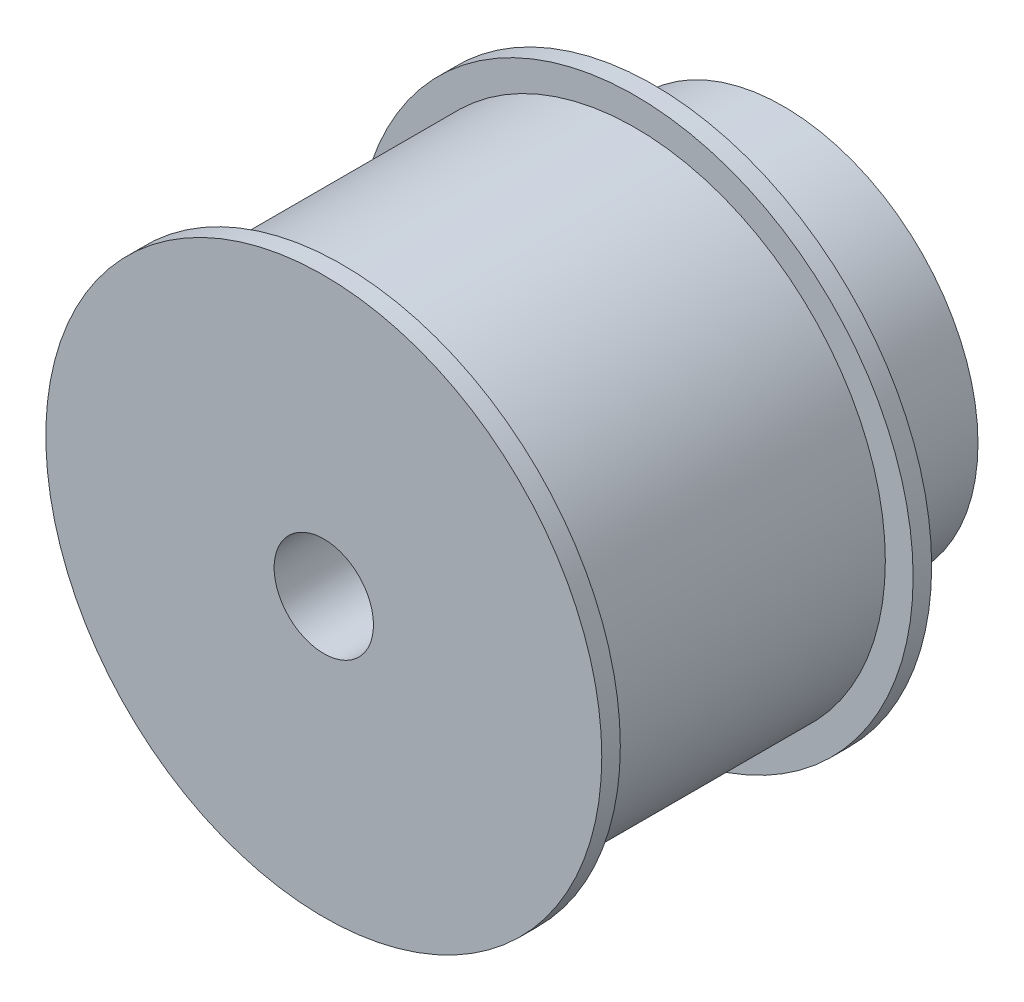
ISO-10303-21;
HEADER;
FILE_DESCRIPTION(('STEP AP214'),'2;1');
FILE_NAME('part.step','',(''),(''),'','','');
FILE_SCHEMA(('AUTOMOTIVE_DESIGN { 1 0 10303 214 1 1 1 1 }'));
ENDSEC;
DATA;
#1=APPLICATION_CONTEXT('core data for automotive mechanical design processes');
#2=APPLICATION_PROTOCOL_DEFINITION('international standard','automotive_design',2000,#1);
#3=PRODUCT_CONTEXT('',#1,'mechanical');
#4=PRODUCT('Part','Part','',(#3));
#5=PRODUCT_RELATED_PRODUCT_CATEGORY('part','',(#4));
#6=PRODUCT_DEFINITION_FORMATION('','',#4);
#7=PRODUCT_DEFINITION_CONTEXT('part definition',#1,'design');
#8=PRODUCT_DEFINITION('design','',#6,#7);
#9=PRODUCT_DEFINITION_SHAPE('','',#8);
#10=(LENGTH_UNIT() NAMED_UNIT(*) SI_UNIT(.MILLI.,.METRE.));
#11=(NAMED_UNIT(*) PLANE_ANGLE_UNIT() SI_UNIT($,.RADIAN.));
#12=(NAMED_UNIT(*) SI_UNIT($,.STERADIAN.) SOLID_ANGLE_UNIT());
#13=UNCERTAINTY_MEASURE_WITH_UNIT(LENGTH_MEASURE(1.E-05),#10,'distance_accuracy_value','');
#14=(GEOMETRIC_REPRESENTATION_CONTEXT(3) GLOBAL_UNCERTAINTY_ASSIGNED_CONTEXT((#13)) GLOBAL_UNIT_ASSIGNED_CONTEXT((#10,
#11,#12)) REPRESENTATION_CONTEXT('',''));
#15=CARTESIAN_POINT('',(0.,0.,0.));
#16=DIRECTION('',(0.,0.,1.));
#17=DIRECTION('',(1.,0.,0.));
#18=AXIS2_PLACEMENT_3D('',#15,#16,#17);
#19=CARTESIAN_POINT('',(0.,0.,0.));
#20=DIRECTION('',(0.,0.,1.));
#21=DIRECTION('',(1.,0.,0.));
#22=AXIS2_PLACEMENT_3D('',#19,#20,#21);
#23=CYLINDRICAL_SURFACE('',#22,2.68);
#24=CARTESIAN_POINT('',(0.,0.,-24.8));
#25=DIRECTION('',(0.,0.,1.));
#26=DIRECTION('',(1.,0.,0.));
#27=AXIS2_PLACEMENT_3D('',#24,#25,#26);
#28=CIRCLE('',#27,2.68);
#29=CARTESIAN_POINT('',(2.68,0.,-24.8));
#30=VERTEX_POINT('',#29);
#31=EDGE_CURVE('E80',#30,#30,#28,.T.);
#32=ORIENTED_EDGE('',*,*,#31,.F.);
#33=EDGE_LOOP('',(#32));
#34=FACE_BOUND('',#33,.T.);
#35=CARTESIAN_POINT('',(0.,0.,0.));
#36=DIRECTION('',(0.,0.,1.));
#37=DIRECTION('',(1.,0.,0.));
#38=AXIS2_PLACEMENT_3D('',#35,#36,#37);
#39=CIRCLE('',#38,2.68);
#40=CARTESIAN_POINT('',(2.68,0.,0.));
#41=VERTEX_POINT('',#40);
#42=EDGE_CURVE('E10',#41,#41,#39,.T.);
#43=ORIENTED_EDGE('',*,*,#42,.T.);
#44=EDGE_LOOP('',(#43));
#45=FACE_BOUND('',#44,.T.);
#46=ADVANCED_FACE('F37',(#34,#45),#23,.F.);
#47=CARTESIAN_POINT('',(0.,2.68,0.));
#48=DIRECTION('',(0.,0.,-1.));
#49=DIRECTION('',(-1.,0.,0.));
#50=AXIS2_PLACEMENT_3D('',#47,#48,#49);
#51=PLANE('',#50);
#52=ORIENTED_EDGE('',*,*,#42,.F.);
#53=EDGE_LOOP('',(#52));
#54=FACE_BOUND('',#53,.T.);
#55=CARTESIAN_POINT('',(0.,0.,0.));
#56=DIRECTION('',(0.,0.,1.));
#57=DIRECTION('',(1.,0.,0.));
#58=AXIS2_PLACEMENT_3D('',#55,#56,#57);
#59=CIRCLE('',#58,15.);
#60=CARTESIAN_POINT('',(15.,0.,0.));
#61=VERTEX_POINT('',#60);
#62=EDGE_CURVE('E44',#61,#61,#59,.T.);
#63=ORIENTED_EDGE('',*,*,#62,.T.);
#64=EDGE_LOOP('',(#63));
#65=FACE_BOUND('',#64,.T.);
#66=ADVANCED_FACE('F88',(#54,#65),#51,.F.);
#67=CARTESIAN_POINT('',(0.,0.,0.));
#68=DIRECTION('',(0.,0.,1.));
#69=DIRECTION('',(1.,0.,0.));
#70=AXIS2_PLACEMENT_3D('',#67,#68,#69);
#71=CYLINDRICAL_SURFACE('',#70,15.);
#72=ORIENTED_EDGE('',*,*,#62,.F.);
#73=EDGE_LOOP('',(#72));
#74=FACE_BOUND('',#73,.T.);
#75=CARTESIAN_POINT('',(0.,0.,-1.));
#76=DIRECTION('',(0.,0.,1.));
#77=DIRECTION('',(1.,0.,0.));
#78=AXIS2_PLACEMENT_3D('',#75,#76,#77);
#79=CIRCLE('',#78,15.);
#80=CARTESIAN_POINT('',(15.,0.,-1.));
#81=VERTEX_POINT('',#80);
#82=EDGE_CURVE('E49',#81,#81,#79,.T.);
#83=ORIENTED_EDGE('',*,*,#82,.T.);
#84=EDGE_LOOP('',(#83));
#85=FACE_BOUND('',#84,.T.);
#86=ADVANCED_FACE('F92',(#74,#85),#71,.T.);
#87=CARTESIAN_POINT('',(0.,15.,-1.));
#88=DIRECTION('',(0.,0.,1.));
#89=DIRECTION('',(1.,0.,0.));
#90=AXIS2_PLACEMENT_3D('',#87,#88,#89);
#91=PLANE('',#90);
#92=ORIENTED_EDGE('',*,*,#82,.F.);
#93=EDGE_LOOP('',(#92));
#94=FACE_BOUND('',#93,.T.);
#95=CARTESIAN_POINT('',(0.,0.,-1.));
#96=DIRECTION('',(0.,0.,1.));
#97=DIRECTION('',(1.,0.,0.));
#98=AXIS2_PLACEMENT_3D('',#95,#96,#97);
#99=CIRCLE('',#98,13.5);
#100=CARTESIAN_POINT('',(13.5,0.,-1.));
#101=VERTEX_POINT('',#100);
#102=EDGE_CURVE('E54',#101,#101,#99,.T.);
#103=ORIENTED_EDGE('',*,*,#102,.T.);
#104=EDGE_LOOP('',(#103));
#105=FACE_BOUND('',#104,.T.);
#106=ADVANCED_FACE('F97',(#94,#105),#91,.F.);
#107=CARTESIAN_POINT('',(0.,0.,0.));
#108=DIRECTION('',(0.,0.,1.));
#109=DIRECTION('',(1.,0.,0.));
#110=AXIS2_PLACEMENT_3D('',#107,#108,#109);
#111=CYLINDRICAL_SURFACE('',#110,13.5);
#112=ORIENTED_EDGE('',*,*,#102,.F.);
#113=EDGE_LOOP('',(#112));
#114=FACE_BOUND('',#113,.T.);
#115=CARTESIAN_POINT('',(0.,0.,-16.8));
#116=DIRECTION('',(0.,0.,1.));
#117=DIRECTION('',(1.,0.,0.));
#118=AXIS2_PLACEMENT_3D('',#115,#116,#117);
#119=CIRCLE('',#118,13.5);
#120=CARTESIAN_POINT('',(13.5,0.,-16.8));
#121=VERTEX_POINT('',#120);
#122=EDGE_CURVE('E60',#121,#121,#119,.T.);
#123=ORIENTED_EDGE('',*,*,#122,.T.);
#124=EDGE_LOOP('',(#123));
#125=FACE_BOUND('',#124,.T.);
#126=ADVANCED_FACE('F103',(#114,#125),#111,.T.);
#127=CARTESIAN_POINT('',(0.,13.5,-16.8));
#128=DIRECTION('',(0.,0.,-1.));
#129=DIRECTION('',(-1.,0.,0.));
#130=AXIS2_PLACEMENT_3D('',#127,#128,#129);
#131=PLANE('',#130);
#132=ORIENTED_EDGE('',*,*,#122,.F.);
#133=EDGE_LOOP('',(#132));
#134=FACE_BOUND('',#133,.T.);
#135=CARTESIAN_POINT('',(0.,0.,-16.8));
#136=DIRECTION('',(0.,0.,1.));
#137=DIRECTION('',(1.,0.,0.));
#138=AXIS2_PLACEMENT_3D('',#135,#136,#137);
#139=CIRCLE('',#138,15.);
#140=CARTESIAN_POINT('',(15.,0.,-16.8));
#141=VERTEX_POINT('',#140);
#142=EDGE_CURVE('E64',#141,#141,#139,.T.);
#143=ORIENTED_EDGE('',*,*,#142,.T.);
#144=EDGE_LOOP('',(#143));
#145=FACE_BOUND('',#144,.T.);
#146=ADVANCED_FACE('F107',(#134,#145),#131,.F.);
#147=CARTESIAN_POINT('',(0.,0.,0.));
#148=DIRECTION('',(0.,0.,1.));
#149=DIRECTION('',(1.,0.,0.));
#150=AXIS2_PLACEMENT_3D('',#147,#148,#149);
#151=CYLINDRICAL_SURFACE('',#150,15.);
#152=ORIENTED_EDGE('',*,*,#142,.F.);
#153=EDGE_LOOP('',(#152));
#154=FACE_BOUND('',#153,.T.);
#155=CARTESIAN_POINT('',(0.,0.,-17.8));
#156=DIRECTION('',(0.,0.,1.));
#157=DIRECTION('',(1.,0.,0.));
#158=AXIS2_PLACEMENT_3D('',#155,#156,#157);
#159=CIRCLE('',#158,15.);
#160=CARTESIAN_POINT('',(15.,0.,-17.8));
#161=VERTEX_POINT('',#160);
#162=EDGE_CURVE('E68',#161,#161,#159,.T.);
#163=ORIENTED_EDGE('',*,*,#162,.T.);
#164=EDGE_LOOP('',(#163));
#165=FACE_BOUND('',#164,.T.);
#166=ADVANCED_FACE('F111',(#154,#165),#151,.T.);
#167=CARTESIAN_POINT('',(0.,15.,-17.8));
#168=DIRECTION('',(0.,0.,1.));
#169=DIRECTION('',(1.,0.,0.));
#170=AXIS2_PLACEMENT_3D('',#167,#168,#169);
#171=PLANE('',#170);
#172=ORIENTED_EDGE('',*,*,#162,.F.);
#173=EDGE_LOOP('',(#172));
#174=FACE_BOUND('',#173,.T.);
#175=CARTESIAN_POINT('',(0.,0.,-17.8));
#176=DIRECTION('',(0.,0.,1.));
#177=DIRECTION('',(1.,0.,0.));
#178=AXIS2_PLACEMENT_3D('',#175,#176,#177);
#179=CIRCLE('',#178,10.5);
#180=CARTESIAN_POINT('',(10.5,0.,-17.8));
#181=VERTEX_POINT('',#180);
#182=EDGE_CURVE('E72',#181,#181,#179,.T.);
#183=ORIENTED_EDGE('',*,*,#182,.T.);
#184=EDGE_LOOP('',(#183));
#185=FACE_BOUND('',#184,.T.);
#186=ADVANCED_FACE('F115',(#174,#185),#171,.F.);
#187=CARTESIAN_POINT('',(0.,0.,0.));
#188=DIRECTION('',(0.,0.,1.));
#189=DIRECTION('',(1.,0.,0.));
#190=AXIS2_PLACEMENT_3D('',#187,#188,#189);
#191=CYLINDRICAL_SURFACE('',#190,10.5);
#192=ORIENTED_EDGE('',*,*,#182,.F.);
#193=EDGE_LOOP('',(#192));
#194=FACE_BOUND('',#193,.T.);
#195=CARTESIAN_POINT('',(0.,0.,-24.8));
#196=DIRECTION('',(0.,0.,1.));
#197=DIRECTION('',(1.,0.,0.));
#198=AXIS2_PLACEMENT_3D('',#195,#196,#197);
#199=CIRCLE('',#198,10.5);
#200=CARTESIAN_POINT('',(10.5,0.,-24.8));
#201=VERTEX_POINT('',#200);
#202=EDGE_CURVE('E76',#201,#201,#199,.T.);
#203=ORIENTED_EDGE('',*,*,#202,.T.);
#204=EDGE_LOOP('',(#203));
#205=FACE_BOUND('',#204,.T.);
#206=ADVANCED_FACE('F119',(#194,#205),#191,.T.);
#207=CARTESIAN_POINT('',(0.,10.5,-24.8));
#208=DIRECTION('',(0.,0.,1.));
#209=DIRECTION('',(1.,0.,0.));
#210=AXIS2_PLACEMENT_3D('',#207,#208,#209);
#211=PLANE('',#210);
#212=ORIENTED_EDGE('',*,*,#202,.F.);
#213=EDGE_LOOP('',(#212));
#214=FACE_BOUND('',#213,.T.);
#215=ORIENTED_EDGE('',*,*,#31,.T.);
#216=EDGE_LOOP('',(#215));
#217=FACE_BOUND('',#216,.T.);
#218=ADVANCED_FACE('F85',(#214,#217),#211,.F.);
#219=CLOSED_SHELL('',(#46,#66,#86,#106,#126,#146,#166,#186,#206,#218));
#220=MANIFOLD_SOLID_BREP('B2',#219);
#221=ADVANCED_BREP_SHAPE_REPRESENTATION('',(#18,#220),#14);
#222=SHAPE_DEFINITION_REPRESENTATION(#9,#221);
ENDSEC;
END-ISO-10303-21;
